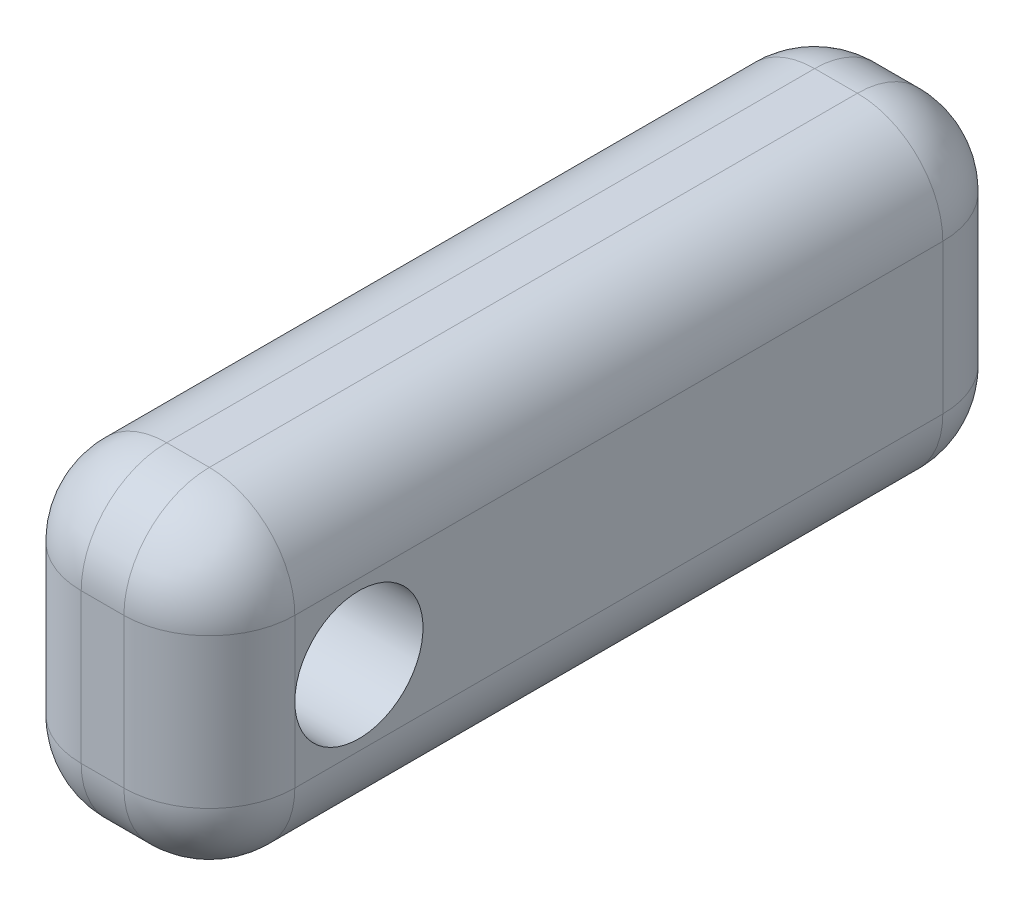
ISO-10303-21;
HEADER;
FILE_DESCRIPTION(('STEP AP214'),'2;1');
FILE_NAME('part.step','',(''),(''),'','','');
FILE_SCHEMA(('AUTOMOTIVE_DESIGN { 1 0 10303 214 1 1 1 1 }'));
ENDSEC;
DATA;
#1=APPLICATION_CONTEXT('core data for automotive mechanical design processes');
#2=APPLICATION_PROTOCOL_DEFINITION('international standard','automotive_design',2000,#1);
#3=PRODUCT_CONTEXT('',#1,'mechanical');
#4=PRODUCT('Part','Part','',(#3));
#5=PRODUCT_RELATED_PRODUCT_CATEGORY('part','',(#4));
#6=PRODUCT_DEFINITION_FORMATION('','',#4);
#7=PRODUCT_DEFINITION_CONTEXT('part definition',#1,'design');
#8=PRODUCT_DEFINITION('design','',#6,#7);
#9=PRODUCT_DEFINITION_SHAPE('','',#8);
#10=(LENGTH_UNIT() NAMED_UNIT(*) SI_UNIT(.MILLI.,.METRE.));
#11=(NAMED_UNIT(*) PLANE_ANGLE_UNIT() SI_UNIT($,.RADIAN.));
#12=(NAMED_UNIT(*) SI_UNIT($,.STERADIAN.) SOLID_ANGLE_UNIT());
#13=UNCERTAINTY_MEASURE_WITH_UNIT(LENGTH_MEASURE(1.E-05),#10,'distance_accuracy_value','');
#14=(GEOMETRIC_REPRESENTATION_CONTEXT(3) GLOBAL_UNCERTAINTY_ASSIGNED_CONTEXT((#13)) GLOBAL_UNIT_ASSIGNED_CONTEXT((#10,
#11,#12)) REPRESENTATION_CONTEXT('',''));
#15=CARTESIAN_POINT('',(0.,0.,0.));
#16=DIRECTION('',(0.,0.,1.));
#17=DIRECTION('',(1.,0.,0.));
#18=AXIS2_PLACEMENT_3D('',#15,#16,#17);
#19=CARTESIAN_POINT('',(6.35,4.7625,0.));
#20=DIRECTION('',(0.,0.,1.));
#21=DIRECTION('',(-1.,0.,0.));
#22=AXIS2_PLACEMENT_3D('',#19,#20,#21);
#23=PLANE('',#22);
#24=CARTESIAN_POINT('',(3.175,0.,0.));
#25=DIRECTION('',(0.,0.,1.));
#26=DIRECTION('',(1.,0.,0.));
#27=AXIS2_PLACEMENT_3D('',#24,#25,#26);
#28=CIRCLE('',#27,1.778);
#29=CARTESIAN_POINT('',(2.54,-1.660740497489,0.));
#30=VERTEX_POINT('',#29);
#31=CARTESIAN_POINT('',(3.81,-1.660740497489,0.));
#32=VERTEX_POINT('',#31);
#33=EDGE_CURVE('E187',#30,#32,#28,.T.);
#34=ORIENTED_EDGE('',*,*,#33,.T.);
#35=DIRECTION('',(0.,-1.,0.));
#36=VECTOR('',#35,1.);
#37=CARTESIAN_POINT('',(3.81,4.7625,0.));
#38=LINE('',#37,#36);
#39=CARTESIAN_POINT('',(3.81,-2.2225,0.));
#40=VERTEX_POINT('',#39);
#41=EDGE_CURVE('E251',#40,#32,#38,.F.);
#42=ORIENTED_EDGE('',*,*,#41,.F.);
#43=DIRECTION('',(1.,0.,0.));
#44=VECTOR('',#43,1.);
#45=CARTESIAN_POINT('',(6.35,-2.2225,0.));
#46=LINE('',#45,#44);
#47=CARTESIAN_POINT('',(2.54,-2.2225,0.));
#48=VERTEX_POINT('',#47);
#49=EDGE_CURVE('E254',#48,#40,#46,.T.);
#50=ORIENTED_EDGE('',*,*,#49,.F.);
#51=DIRECTION('',(0.,-1.,0.));
#52=VECTOR('',#51,1.);
#53=CARTESIAN_POINT('',(2.54,4.7625,0.));
#54=LINE('',#53,#52);
#55=EDGE_CURVE('E257',#30,#48,#54,.T.);
#56=ORIENTED_EDGE('',*,*,#55,.F.);
#57=EDGE_LOOP('',(#34,#42,#50,#56));
#58=FACE_BOUND('',#57,.T.);
#59=ADVANCED_FACE('F47',(#58),#23,.F.);
#60=DIRECTION('',(1.,0.,0.));
#61=VECTOR('',#60,1.);
#62=CARTESIAN_POINT('',(6.35,2.2225,0.));
#63=LINE('',#62,#61);
#64=CARTESIAN_POINT('',(3.81,2.2225,0.));
#65=VERTEX_POINT('',#64);
#66=CARTESIAN_POINT('',(2.54,2.2225,0.));
#67=VERTEX_POINT('',#66);
#68=EDGE_CURVE('E245',#65,#67,#63,.F.);
#69=ORIENTED_EDGE('',*,*,#68,.F.);
#70=DIRECTION('',(0.,-1.,0.));
#71=VECTOR('',#70,1.);
#72=CARTESIAN_POINT('',(3.81,4.7625,0.));
#73=LINE('',#72,#71);
#74=CARTESIAN_POINT('',(3.81,1.660740497489,0.));
#75=VERTEX_POINT('',#74);
#76=EDGE_CURVE('E242',#75,#65,#73,.F.);
#77=ORIENTED_EDGE('',*,*,#76,.F.);
#78=CARTESIAN_POINT('',(2.54,1.660740497489,0.));
#79=VERTEX_POINT('',#78);
#80=EDGE_CURVE('E192',#75,#79,#28,.T.);
#81=ORIENTED_EDGE('',*,*,#80,.T.);
#82=DIRECTION('',(0.,-1.,0.));
#83=VECTOR('',#82,1.);
#84=CARTESIAN_POINT('',(2.54,4.7625,0.));
#85=LINE('',#84,#83);
#86=EDGE_CURVE('E248',#67,#79,#85,.T.);
#87=ORIENTED_EDGE('',*,*,#86,.F.);
#88=EDGE_LOOP('',(#69,#77,#81,#87));
#89=FACE_BOUND('',#88,.T.);
#90=ADVANCED_FACE('F366',(#89),#23,.F.);
#91=CARTESIAN_POINT('',(6.35,4.7625,24.3397581415084));
#92=DIRECTION('',(-1.,0.,0.));
#93=DIRECTION('',(0.,0.,-1.));
#94=AXIS2_PLACEMENT_3D('',#91,#92,#93);
#95=PLANE('',#94);
#96=DIRECTION('',(0.,0.,1.));
#97=VECTOR('',#96,1.);
#98=CARTESIAN_POINT('',(6.35,-2.2225,24.3397581415084));
#99=LINE('',#98,#97);
#100=CARTESIAN_POINT('',(6.35,-2.2225,2.54));
#101=VERTEX_POINT('',#100);
#102=CARTESIAN_POINT('',(6.35,-2.2225,21.7997581415084));
#103=VERTEX_POINT('',#102);
#104=EDGE_CURVE('E208',#101,#103,#99,.T.);
#105=ORIENTED_EDGE('',*,*,#104,.F.);
#106=DIRECTION('',(0.,-1.,0.));
#107=VECTOR('',#106,1.);
#108=CARTESIAN_POINT('',(6.35,4.7625,2.54));
#109=LINE('',#108,#107);
#110=CARTESIAN_POINT('',(6.35,2.2225,2.54));
#111=VERTEX_POINT('',#110);
#112=EDGE_CURVE('E200',#111,#101,#109,.T.);
#113=ORIENTED_EDGE('',*,*,#112,.F.);
#114=DIRECTION('',(0.,0.,1.));
#115=VECTOR('',#114,1.);
#116=CARTESIAN_POINT('',(6.35,2.2225,24.3397581415084));
#117=LINE('',#116,#115);
#118=CARTESIAN_POINT('',(6.35,2.2225,21.7997581415084));
#119=VERTEX_POINT('',#118);
#120=EDGE_CURVE('E205',#119,#111,#117,.F.);
#121=ORIENTED_EDGE('',*,*,#120,.F.);
#122=DIRECTION('',(0.,-1.,0.));
#123=VECTOR('',#122,1.);
#124=CARTESIAN_POINT('',(6.35,4.7625,21.7997581415084));
#125=LINE('',#124,#123);
#126=CARTESIAN_POINT('',(6.35,0.,21.7997581415084));
#127=VERTEX_POINT('',#126);
#128=EDGE_CURVE('E172',#127,#119,#125,.F.);
#129=ORIENTED_EDGE('',*,*,#128,.F.);
#130=CARTESIAN_POINT('',(6.35,0.,19.8947581415084));
#131=DIRECTION('',(1.,0.,0.));
#132=DIRECTION('',(0.,0.,-1.));
#133=AXIS2_PLACEMENT_3D('',#130,#131,#132);
#134=CIRCLE('',#133,1.905);
#135=EDGE_CURVE('E184',#127,#127,#134,.T.);
#136=ORIENTED_EDGE('',*,*,#135,.F.);
#137=DIRECTION('',(0.,-1.,0.));
#138=VECTOR('',#137,1.);
#139=CARTESIAN_POINT('',(6.35,4.7625,21.7997581415084));
#140=LINE('',#139,#138);
#141=EDGE_CURVE('E168',#103,#127,#140,.F.);
#142=ORIENTED_EDGE('',*,*,#141,.F.);
#143=EDGE_LOOP('',(#105,#113,#121,#129,#136,#142));
#144=FACE_BOUND('',#143,.T.);
#145=ADVANCED_FACE('F372',(#144),#95,.F.);
#146=CARTESIAN_POINT('',(0.,4.7625,24.3397581415084));
#147=DIRECTION('',(0.,0.,-1.));
#148=DIRECTION('',(1.,0.,0.));
#149=AXIS2_PLACEMENT_3D('',#146,#147,#148);
#150=PLANE('',#149);
#151=DIRECTION('',(-1.,0.,0.));
#152=VECTOR('',#151,1.);
#153=CARTESIAN_POINT('',(0.,2.2225,24.3397581415084));
#154=LINE('',#153,#152);
#155=CARTESIAN_POINT('',(2.54,2.2225,24.3397581415084));
#156=VERTEX_POINT('',#155);
#157=CARTESIAN_POINT('',(3.81,2.2225,24.3397581415084));
#158=VERTEX_POINT('',#157);
#159=EDGE_CURVE('E282',#156,#158,#154,.F.);
#160=ORIENTED_EDGE('',*,*,#159,.F.);
#161=DIRECTION('',(0.,-1.,0.));
#162=VECTOR('',#161,1.);
#163=CARTESIAN_POINT('',(2.54,4.7625,24.3397581415084));
#164=LINE('',#163,#162);
#165=CARTESIAN_POINT('',(2.54,-2.2225,24.3397581415084));
#166=VERTEX_POINT('',#165);
#167=EDGE_CURVE('E278',#166,#156,#164,.F.);
#168=ORIENTED_EDGE('',*,*,#167,.F.);
#169=DIRECTION('',(-1.,0.,0.));
#170=VECTOR('',#169,1.);
#171=CARTESIAN_POINT('',(0.,-2.2225,24.3397581415084));
#172=LINE('',#171,#170);
#173=CARTESIAN_POINT('',(3.81,-2.2225,24.3397581415084));
#174=VERTEX_POINT('',#173);
#175=EDGE_CURVE('E274',#174,#166,#172,.T.);
#176=ORIENTED_EDGE('',*,*,#175,.F.);
#177=DIRECTION('',(0.,-1.,0.));
#178=VECTOR('',#177,1.);
#179=CARTESIAN_POINT('',(3.81,4.7625,24.3397581415084));
#180=LINE('',#179,#178);
#181=EDGE_CURVE('E285',#158,#174,#180,.T.);
#182=ORIENTED_EDGE('',*,*,#181,.F.);
#183=EDGE_LOOP('',(#160,#168,#176,#182));
#184=FACE_BOUND('',#183,.T.);
#185=ADVANCED_FACE('F483',(#184),#150,.F.);
#186=CARTESIAN_POINT('',(0.,4.7625,0.));
#187=DIRECTION('',(1.,0.,0.));
#188=DIRECTION('',(0.,0.,1.));
#189=AXIS2_PLACEMENT_3D('',#186,#187,#188);
#190=PLANE('',#189);
#191=DIRECTION('',(0.,0.,-1.));
#192=VECTOR('',#191,1.);
#193=CARTESIAN_POINT('',(0.,2.2225,0.));
#194=LINE('',#193,#192);
#195=CARTESIAN_POINT('',(0.,2.2225,2.54));
#196=VERTEX_POINT('',#195);
#197=CARTESIAN_POINT('',(0.,2.2225,21.7997581415084));
#198=VERTEX_POINT('',#197);
#199=EDGE_CURVE('E227',#196,#198,#194,.F.);
#200=ORIENTED_EDGE('',*,*,#199,.F.);
#201=DIRECTION('',(0.,-1.,0.));
#202=VECTOR('',#201,1.);
#203=CARTESIAN_POINT('',(0.,4.7625,2.54));
#204=LINE('',#203,#202);
#205=CARTESIAN_POINT('',(0.,-2.2225,2.54));
#206=VERTEX_POINT('',#205);
#207=EDGE_CURVE('E224',#206,#196,#204,.F.);
#208=ORIENTED_EDGE('',*,*,#207,.F.);
#209=DIRECTION('',(0.,0.,-1.));
#210=VECTOR('',#209,1.);
#211=CARTESIAN_POINT('',(0.,-2.2225,0.));
#212=LINE('',#211,#210);
#213=CARTESIAN_POINT('',(0.,-2.2225,21.7997581415084));
#214=VERTEX_POINT('',#213);
#215=EDGE_CURVE('E231',#214,#206,#212,.T.);
#216=ORIENTED_EDGE('',*,*,#215,.F.);
#217=DIRECTION('',(0.,-1.,0.));
#218=VECTOR('',#217,1.);
#219=CARTESIAN_POINT('',(0.,4.7625,21.7997581415084));
#220=LINE('',#219,#218);
#221=CARTESIAN_POINT('',(0.,0.,21.7997581415084));
#222=VERTEX_POINT('',#221);
#223=EDGE_CURVE('E235',#222,#214,#220,.T.);
#224=ORIENTED_EDGE('',*,*,#223,.F.);
#225=CARTESIAN_POINT('',(0.,0.,19.8947581415084));
#226=DIRECTION('',(1.,0.,0.));
#227=DIRECTION('',(0.,0.,-1.));
#228=AXIS2_PLACEMENT_3D('',#225,#226,#227);
#229=CIRCLE('',#228,1.905);
#230=EDGE_CURVE('E188',#222,#222,#229,.T.);
#231=ORIENTED_EDGE('',*,*,#230,.T.);
#232=DIRECTION('',(0.,-1.,0.));
#233=VECTOR('',#232,1.);
#234=CARTESIAN_POINT('',(0.,4.7625,21.7997581415084));
#235=LINE('',#234,#233);
#236=EDGE_CURVE('E239',#198,#222,#235,.T.);
#237=ORIENTED_EDGE('',*,*,#236,.F.);
#238=EDGE_LOOP('',(#200,#208,#216,#224,#231,#237));
#239=FACE_BOUND('',#238,.T.);
#240=ADVANCED_FACE('F477',(#239),#190,.F.);
#241=CARTESIAN_POINT('',(0.,4.7625,0.));
#242=DIRECTION('',(0.,-1.,0.));
#243=DIRECTION('',(0.,0.,1.));
#244=AXIS2_PLACEMENT_3D('',#241,#242,#243);
#245=PLANE('',#244);
#246=DIRECTION('',(0.,0.,-1.));
#247=VECTOR('',#246,1.);
#248=CARTESIAN_POINT('',(2.54,4.7625,0.));
#249=LINE('',#248,#247);
#250=CARTESIAN_POINT('',(2.54,4.7625,21.7997581415084));
#251=VERTEX_POINT('',#250);
#252=CARTESIAN_POINT('',(2.54,4.7625,2.54));
#253=VERTEX_POINT('',#252);
#254=EDGE_CURVE('E267',#251,#253,#249,.T.);
#255=ORIENTED_EDGE('',*,*,#254,.F.);
#256=DIRECTION('',(-1.,0.,0.));
#257=VECTOR('',#256,1.);
#258=CARTESIAN_POINT('',(0.,4.7625,21.7997581415084));
#259=LINE('',#258,#257);
#260=CARTESIAN_POINT('',(3.81,4.7625,21.7997581415084));
#261=VERTEX_POINT('',#260);
#262=EDGE_CURVE('E260',#261,#251,#259,.T.);
#263=ORIENTED_EDGE('',*,*,#262,.F.);
#264=DIRECTION('',(0.,0.,1.));
#265=VECTOR('',#264,1.);
#266=CARTESIAN_POINT('',(3.81,4.7625,0.));
#267=LINE('',#266,#265);
#268=CARTESIAN_POINT('',(3.81,4.7625,2.54));
#269=VERTEX_POINT('',#268);
#270=EDGE_CURVE('E263',#269,#261,#267,.T.);
#271=ORIENTED_EDGE('',*,*,#270,.F.);
#272=DIRECTION('',(1.,0.,0.));
#273=VECTOR('',#272,1.);
#274=CARTESIAN_POINT('',(0.,4.7625,2.54));
#275=LINE('',#274,#273);
#276=EDGE_CURVE('E271',#253,#269,#275,.T.);
#277=ORIENTED_EDGE('',*,*,#276,.F.);
#278=EDGE_LOOP('',(#255,#263,#271,#277));
#279=FACE_BOUND('',#278,.T.);
#280=ADVANCED_FACE('F490',(#279),#245,.F.);
#281=CARTESIAN_POINT('',(0.,-4.7625,0.));
#282=DIRECTION('',(0.,-1.,0.));
#283=DIRECTION('',(0.,0.,1.));
#284=AXIS2_PLACEMENT_3D('',#281,#282,#283);
#285=PLANE('',#284);
#286=DIRECTION('',(0.,0.,1.));
#287=VECTOR('',#286,1.);
#288=CARTESIAN_POINT('',(3.81,-4.7625,0.));
#289=LINE('',#288,#287);
#290=CARTESIAN_POINT('',(3.81,-4.7625,21.7997581415084));
#291=VERTEX_POINT('',#290);
#292=CARTESIAN_POINT('',(3.81,-4.7625,2.54));
#293=VERTEX_POINT('',#292);
#294=EDGE_CURVE('E218',#291,#293,#289,.F.);
#295=ORIENTED_EDGE('',*,*,#294,.F.);
#296=DIRECTION('',(-1.,0.,0.));
#297=VECTOR('',#296,1.);
#298=CARTESIAN_POINT('',(6.35,-4.7625,21.7997581415084));
#299=LINE('',#298,#297);
#300=CARTESIAN_POINT('',(2.54,-4.7625,21.7997581415084));
#301=VERTEX_POINT('',#300);
#302=EDGE_CURVE('E181',#301,#291,#299,.F.);
#303=ORIENTED_EDGE('',*,*,#302,.F.);
#304=DIRECTION('',(0.,0.,-1.));
#305=VECTOR('',#304,1.);
#306=CARTESIAN_POINT('',(2.54,-4.7625,24.3397581415084));
#307=LINE('',#306,#305);
#308=CARTESIAN_POINT('',(2.54,-4.7625,2.54));
#309=VERTEX_POINT('',#308);
#310=EDGE_CURVE('E215',#309,#301,#307,.F.);
#311=ORIENTED_EDGE('',*,*,#310,.F.);
#312=DIRECTION('',(1.,0.,0.));
#313=VECTOR('',#312,1.);
#314=CARTESIAN_POINT('',(0.,-4.7625,2.54));
#315=LINE('',#314,#313);
#316=EDGE_CURVE('E221',#293,#309,#315,.F.);
#317=ORIENTED_EDGE('',*,*,#316,.F.);
#318=EDGE_LOOP('',(#295,#303,#311,#317));
#319=FACE_BOUND('',#318,.T.);
#320=ADVANCED_FACE('F415',(#319),#285,.T.);
#321=CARTESIAN_POINT('',(3.175,0.,9.525));
#322=DIRECTION('',(0.,0.,-1.));
#323=DIRECTION('',(1.,0.,0.));
#324=AXIS2_PLACEMENT_3D('',#321,#322,#323);
#325=CYLINDRICAL_SURFACE('',#324,1.778);
#326=CARTESIAN_POINT('',(3.175,0.,9.525));
#327=DIRECTION('',(0.,0.,1.));
#328=DIRECTION('',(1.,0.,0.));
#329=AXIS2_PLACEMENT_3D('',#326,#327,#328);
#330=CIRCLE('',#329,1.778);
#331=CARTESIAN_POINT('',(4.953,0.,9.525));
#332=VERTEX_POINT('',#331);
#333=EDGE_CURVE('E198',#332,#332,#330,.T.);
#334=ORIENTED_EDGE('',*,*,#333,.T.);
#335=EDGE_LOOP('',(#334));
#336=FACE_BOUND('',#335,.T.);
#337=ORIENTED_EDGE('',*,*,#80,.F.);
#338=CARTESIAN_POINT('',(3.81,-1.660740497489,0.));
#339=CARTESIAN_POINT('',(3.85452772926789,-1.6437187364104,-4.68155323378838E-06));
#340=CARTESIAN_POINT('',(3.89833473831323,-1.62491135271473,0.00117147703703333));
#341=CARTESIAN_POINT('',(3.9841805562793,-1.58390975104958,0.00561595792695614));
#342=CARTESIAN_POINT('',(4.02622082868699,-1.5617184096697,0.0088825107208981));
#343=CARTESIAN_POINT('',(4.14881719803869,-1.49058475891008,0.0213669359738534));
#344=CARTESIAN_POINT('',(4.22639395181376,-1.43687275632313,0.033276135830476));
#345=CARTESIAN_POINT('',(4.3713338813828,-1.31864090358608,0.0617014759921788));
#346=CARTESIAN_POINT('',(4.43872511118705,-1.25415180943826,0.078204592814445));
#347=CARTESIAN_POINT('',(4.56252924128273,-1.11565543579056,0.113182472353516));
#348=CARTESIAN_POINT('',(4.6189226201244,-1.04163161163532,0.131660652483963));
#349=CARTESIAN_POINT('',(4.72360156832052,-0.879303036611328,0.16928822319485));
#350=CARTESIAN_POINT('',(4.77087892631078,-0.790329753933799,0.188373227754642));
#351=CARTESIAN_POINT('',(4.84992850370309,-0.605003459714666,0.222240343505682));
#352=CARTESIAN_POINT('',(4.88171235848853,-0.508656049141545,0.237025680304498));
#353=CARTESIAN_POINT('',(4.92800469058137,-0.313231501164486,0.25913979592096));
#354=CARTESIAN_POINT('',(4.94287000558628,-0.214257636644788,0.266622103018877));
#355=CARTESIAN_POINT('',(4.95573408599836,-0.0149693635533953,0.273073570055918));
#356=CARTESIAN_POINT('',(4.95374327855501,0.0853441779541245,0.27204799295599));
#357=CARTESIAN_POINT('',(4.93404265094767,0.27423098527128,0.26223398938119));
#358=CARTESIAN_POINT('',(4.9178543382215,0.363009553980252,0.254197348736134));
#359=CARTESIAN_POINT('',(4.8724961488604,0.536503942080445,0.232766751731216));
#360=CARTESIAN_POINT('',(4.84332159940513,0.621218286881341,0.219370867137493));
#361=CARTESIAN_POINT('',(4.77138788169125,0.788328847267599,0.188634249129413));
#362=CARTESIAN_POINT('',(4.72809890562674,0.870469081955778,0.171148753814196));
#363=CARTESIAN_POINT('',(4.62937860299746,1.02695418285871,0.135218258689977));
#364=CARTESIAN_POINT('',(4.57393556606563,1.10129142807956,0.11677234668491));
#365=CARTESIAN_POINT('',(4.44608426252645,1.24736965148504,0.0799519575862334));
#366=CARTESIAN_POINT('',(4.37256149283965,1.31818476984897,0.0617525214542067));
#367=CARTESIAN_POINT('',(4.2138269233365,1.44654000964742,0.0310144133001352));
#368=CARTESIAN_POINT('',(4.1286458306184,1.50411397338244,0.0184612299725655));
#369=CARTESIAN_POINT('',(4.00215608146291,1.57444475177786,0.00700800270153899));
#370=CARTESIAN_POINT('',(3.96462685519834,1.59359703142778,0.00442262873260868));
#371=CARTESIAN_POINT('',(3.88825291885346,1.62921050026388,0.000918070527373948));
#372=CARTESIAN_POINT('',(3.8494086209482,1.64567252338552,-1.63093482095433E-06));
#373=CARTESIAN_POINT('',(3.81,1.660740497489,0.));
#374=B_SPLINE_CURVE_WITH_KNOTS('',3,(#338,#339,#340,#341,#342,#343,#344,#345,#346,#347,#348,
#349,#350,#351,#352,#353,#354,#355,#356,#357,#358,#359,#360,#361,#362,#363,#364,#365,#366,#367,
#368,#369,#370,#371,#372,#373),.UNSPECIFIED.,.F.,.F.,(4,2,2,2,2,2,2,2,2,2,2,2,2,2,2,2,2,4),(0.,
0.142894710670892,0.28566862157115,0.56948911396482,0.852513045787876,1.13603486854599,
1.44221640250242,1.74816764321626,2.04753883272512,2.34672484560268,2.61729798810029,
2.88796856937623,3.17026852735781,3.45284168461751,3.76239960349769,4.07115732388665,
4.1976791691344,4.32416171998233),.UNSPECIFIED.);
#375=EDGE_CURVE('E56',#32,#75,#374,.T.);
#376=ORIENTED_EDGE('',*,*,#375,.F.);
#377=ORIENTED_EDGE('',*,*,#33,.F.);
#378=CARTESIAN_POINT('',(2.54,1.660740497489,0.));
#379=CARTESIAN_POINT('',(2.49547227073211,1.6437187364104,-4.6815532339741E-06));
#380=CARTESIAN_POINT('',(2.45166526168677,1.62491135271473,0.00117147703703294));
#381=CARTESIAN_POINT('',(2.3658194437207,1.58390975104958,0.00561595792695538));
#382=CARTESIAN_POINT('',(2.32377917131301,1.5617184096697,0.00888251072089721));
#383=CARTESIAN_POINT('',(2.2011828019613,1.49058475891008,0.0213669359738522));
#384=CARTESIAN_POINT('',(2.12360604818624,1.43687275632313,0.0332761358304749));
#385=CARTESIAN_POINT('',(1.9786661186172,1.31864090358608,0.0617014759921781));
#386=CARTESIAN_POINT('',(1.91127488881294,1.25415180943826,0.0782045928144446));
#387=CARTESIAN_POINT('',(1.78747075871726,1.11565543579056,0.113182472353515));
#388=CARTESIAN_POINT('',(1.7310773798756,1.04163161163532,0.131660652483962));
#389=CARTESIAN_POINT('',(1.62639843167948,0.879303036611327,0.169288223194848));
#390=CARTESIAN_POINT('',(1.57912107368922,0.790329753933799,0.188373227754641));
#391=CARTESIAN_POINT('',(1.50007149629691,0.605003459714666,0.222240343505681));
#392=CARTESIAN_POINT('',(1.46828764151147,0.508656049141545,0.237025680304497));
#393=CARTESIAN_POINT('',(1.42199530941863,0.313231501164487,0.259139795920959));
#394=CARTESIAN_POINT('',(1.40712999441372,0.214257636644788,0.266622103018876));
#395=CARTESIAN_POINT('',(1.39426591400164,0.0149693635533956,0.273073570055917));
#396=CARTESIAN_POINT('',(1.39625672144499,-0.0853441779541243,0.27204799295599));
#397=CARTESIAN_POINT('',(1.41595734905233,-0.274230985271281,0.26223398938119));
#398=CARTESIAN_POINT('',(1.4321456617785,-0.363009553980252,0.254197348736134));
#399=CARTESIAN_POINT('',(1.47750385113959,-0.536503942080445,0.232766751731216));
#400=CARTESIAN_POINT('',(1.50667840059487,-0.621218286881341,0.219370867137492));
#401=CARTESIAN_POINT('',(1.57861211830875,-0.788328847267598,0.188634249129412));
#402=CARTESIAN_POINT('',(1.62190109437326,-0.870469081955778,0.171148753814195));
#403=CARTESIAN_POINT('',(1.72062139700254,-1.02695418285871,0.135218258689976));
#404=CARTESIAN_POINT('',(1.77606443393437,-1.10129142807956,0.11677234668491));
#405=CARTESIAN_POINT('',(1.90391573747355,-1.24736965148504,0.0799519575862327));
#406=CARTESIAN_POINT('',(1.97743850716035,-1.31818476984897,0.0617525214542059));
#407=CARTESIAN_POINT('',(2.1361730766635,-1.44654000964742,0.0310144133001349));
#408=CARTESIAN_POINT('',(2.2213541693816,-1.50411397338244,0.0184612299725658));
#409=CARTESIAN_POINT('',(2.34784391853709,-1.57444475177786,0.00700800270153869));
#410=CARTESIAN_POINT('',(2.38537314480166,-1.59359703142778,0.004422628732608));
#411=CARTESIAN_POINT('',(2.46174708114654,-1.62921050026388,0.000918070527372723));
#412=CARTESIAN_POINT('',(2.5005913790518,-1.64567252338552,-1.6309348223602E-06));
#413=CARTESIAN_POINT('',(2.54,-1.660740497489,0.));
#414=B_SPLINE_CURVE_WITH_KNOTS('',3,(#378,#379,#380,#381,#382,#383,#384,#385,#386,#387,#388,
#389,#390,#391,#392,#393,#394,#395,#396,#397,#398,#399,#400,#401,#402,#403,#404,#405,#406,#407,
#408,#409,#410,#411,#412,#413),.UNSPECIFIED.,.F.,.F.,(4,2,2,2,2,2,2,2,2,2,2,2,2,2,2,2,2,4),(0.,
0.142894710670891,0.28566862157115,0.56948911396482,0.852513045787876,1.13603486854599,
1.44221640250242,1.74816764321626,2.04753883272512,2.34672484560268,2.61729798810029,
2.88796856937623,3.17026852735781,3.45284168461751,3.76239960349769,4.07115732388665,
4.1976791691344,4.32416171998233),.UNSPECIFIED.);
#415=EDGE_CURVE('E11',#79,#30,#414,.T.);
#416=ORIENTED_EDGE('',*,*,#415,.F.);
#417=EDGE_LOOP('',(#337,#376,#377,#416));
#418=FACE_BOUND('',#417,.T.);
#419=ADVANCED_FACE('F300',(#336,#418),#325,.F.);
#420=CARTESIAN_POINT('',(3.175,0.,9.525));
#421=DIRECTION('',(0.,0.,-1.));
#422=DIRECTION('',(1.,0.,0.));
#423=AXIS2_PLACEMENT_3D('',#420,#421,#422);
#424=PLANE('',#423);
#425=ORIENTED_EDGE('',*,*,#333,.F.);
#426=EDGE_LOOP('',(#425));
#427=FACE_BOUND('',#426,.T.);
#428=ADVANCED_FACE('F529',(#427),#424,.T.);
#429=CARTESIAN_POINT('',(9.525,0.,19.8947581415084));
#430=DIRECTION('',(-1.,0.,0.));
#431=DIRECTION('',(0.,0.,-1.));
#432=AXIS2_PLACEMENT_3D('',#429,#430,#431);
#433=CYLINDRICAL_SURFACE('',#432,1.905);
#434=ORIENTED_EDGE('',*,*,#230,.F.);
#435=EDGE_LOOP('',(#434));
#436=FACE_BOUND('',#435,.T.);
#437=ORIENTED_EDGE('',*,*,#135,.T.);
#438=EDGE_LOOP('',(#437));
#439=FACE_BOUND('',#438,.T.);
#440=ADVANCED_FACE('F185',(#436,#439),#433,.F.);
#441=CARTESIAN_POINT('',(2.54,2.2225,0.));
#442=DIRECTION('',(0.,0.,-1.));
#443=DIRECTION('',(1.,0.,0.));
#444=AXIS2_PLACEMENT_3D('',#441,#442,#443);
#445=CYLINDRICAL_SURFACE('',#444,2.54);
#446=CARTESIAN_POINT('',(2.54,2.2225,2.54));
#447=DIRECTION('',(0.,0.,1.));
#448=DIRECTION('',(1.,0.,0.));
#449=AXIS2_PLACEMENT_3D('',#446,#447,#448);
#450=CIRCLE('',#449,2.54);
#451=EDGE_CURVE('E51',#253,#196,#450,.T.);
#452=ORIENTED_EDGE('',*,*,#451,.T.);
#453=ORIENTED_EDGE('',*,*,#199,.T.);
#454=CARTESIAN_POINT('',(2.54,2.2225,21.7997581415084));
#455=DIRECTION('',(0.,0.,-1.));
#456=DIRECTION('',(-1.,0.,0.));
#457=AXIS2_PLACEMENT_3D('',#454,#455,#456);
#458=CIRCLE('',#457,2.54);
#459=EDGE_CURVE('E463',#198,#251,#458,.T.);
#460=ORIENTED_EDGE('',*,*,#459,.T.);
#461=ORIENTED_EDGE('',*,*,#254,.T.);
#462=EDGE_LOOP('',(#452,#453,#460,#461));
#463=FACE_BOUND('',#462,.T.);
#464=ADVANCED_FACE('F49',(#463),#445,.T.);
#465=CARTESIAN_POINT('',(2.54,2.2225,2.54));
#466=DIRECTION('',(-1.,0.,0.));
#467=DIRECTION('',(0.,0.,-1.));
#468=AXIS2_PLACEMENT_3D('',#465,#466,#467);
#469=SPHERICAL_SURFACE('',#468,2.54);
#470=CARTESIAN_POINT('',(2.54,2.2225,2.54));
#471=DIRECTION('',(1.,0.,0.));
#472=DIRECTION('',(0.,0.,-1.));
#473=AXIS2_PLACEMENT_3D('',#470,#471,#472);
#474=CIRCLE('',#473,2.54);
#475=EDGE_CURVE('E460',#253,#67,#474,.F.);
#476=ORIENTED_EDGE('',*,*,#475,.T.);
#477=CARTESIAN_POINT('',(2.54,2.2225,2.54));
#478=DIRECTION('',(0.,-1.,0.));
#479=DIRECTION('',(0.,0.,-1.));
#480=AXIS2_PLACEMENT_3D('',#477,#478,#479);
#481=CIRCLE('',#480,2.54);
#482=EDGE_CURVE('E462',#67,#196,#481,.F.);
#483=ORIENTED_EDGE('',*,*,#482,.T.);
#484=ORIENTED_EDGE('',*,*,#451,.F.);
#485=EDGE_LOOP('',(#476,#483,#484));
#486=FACE_BOUND('',#485,.T.);
#487=ADVANCED_FACE('F356',(#486),#469,.T.);
#488=CARTESIAN_POINT('',(2.54,2.2225,21.7997581415084));
#489=DIRECTION('',(0.,1.,0.));
#490=DIRECTION('',(0.,0.,-1.));
#491=AXIS2_PLACEMENT_3D('',#488,#489,#490);
#492=SPHERICAL_SURFACE('',#491,2.54);
#493=CARTESIAN_POINT('',(2.54,2.2225,21.7997581415084));
#494=DIRECTION('',(0.,-1.,0.));
#495=DIRECTION('',(0.,0.,-1.));
#496=AXIS2_PLACEMENT_3D('',#493,#494,#495);
#497=CIRCLE('',#496,2.54);
#498=EDGE_CURVE('E455',#198,#156,#497,.F.);
#499=ORIENTED_EDGE('',*,*,#498,.T.);
#500=CARTESIAN_POINT('',(2.54,2.2225,21.7997581415084));
#501=DIRECTION('',(1.,0.,0.));
#502=DIRECTION('',(0.,0.,-1.));
#503=AXIS2_PLACEMENT_3D('',#500,#501,#502);
#504=CIRCLE('',#503,2.54);
#505=EDGE_CURVE('E78',#156,#251,#504,.F.);
#506=ORIENTED_EDGE('',*,*,#505,.T.);
#507=ORIENTED_EDGE('',*,*,#459,.F.);
#508=EDGE_LOOP('',(#499,#506,#507));
#509=FACE_BOUND('',#508,.T.);
#510=ADVANCED_FACE('F353',(#509),#492,.T.);
#511=CARTESIAN_POINT('',(2.54,4.7625,2.54));
#512=DIRECTION('',(0.,-1.,0.));
#513=DIRECTION('',(0.,0.,1.));
#514=AXIS2_PLACEMENT_3D('',#511,#512,#513);
#515=CYLINDRICAL_SURFACE('',#514,2.54);
#516=ORIENTED_EDGE('',*,*,#482,.F.);
#517=ORIENTED_EDGE('',*,*,#86,.T.);
#518=ORIENTED_EDGE('',*,*,#415,.T.);
#519=ORIENTED_EDGE('',*,*,#55,.T.);
#520=CARTESIAN_POINT('',(2.54,-2.2225,2.54));
#521=DIRECTION('',(0.,1.,0.));
#522=DIRECTION('',(0.,0.,1.));
#523=AXIS2_PLACEMENT_3D('',#520,#521,#522);
#524=CIRCLE('',#523,2.54);
#525=EDGE_CURVE('E451',#48,#206,#524,.T.);
#526=ORIENTED_EDGE('',*,*,#525,.T.);
#527=ORIENTED_EDGE('',*,*,#207,.T.);
#528=EDGE_LOOP('',(#516,#517,#518,#519,#526,#527));
#529=FACE_BOUND('',#528,.T.);
#530=ADVANCED_FACE('F348',(#529),#515,.T.);
#531=CARTESIAN_POINT('',(0.,2.2225,2.54));
#532=DIRECTION('',(1.,0.,0.));
#533=DIRECTION('',(0.,0.,1.));
#534=AXIS2_PLACEMENT_3D('',#531,#532,#533);
#535=CYLINDRICAL_SURFACE('',#534,2.54);
#536=ORIENTED_EDGE('',*,*,#475,.F.);
#537=ORIENTED_EDGE('',*,*,#276,.T.);
#538=CARTESIAN_POINT('',(3.81,2.2225,2.54));
#539=DIRECTION('',(-1.,0.,0.));
#540=DIRECTION('',(0.,0.,1.));
#541=AXIS2_PLACEMENT_3D('',#538,#539,#540);
#542=CIRCLE('',#541,2.54);
#543=EDGE_CURVE('E448',#269,#65,#542,.T.);
#544=ORIENTED_EDGE('',*,*,#543,.T.);
#545=ORIENTED_EDGE('',*,*,#68,.T.);
#546=EDGE_LOOP('',(#536,#537,#544,#545));
#547=FACE_BOUND('',#546,.T.);
#548=ADVANCED_FACE('F345',(#547),#535,.T.);
#549=CARTESIAN_POINT('',(3.81,2.2225,0.));
#550=DIRECTION('',(0.,0.,1.));
#551=DIRECTION('',(-1.,0.,0.));
#552=AXIS2_PLACEMENT_3D('',#549,#550,#551);
#553=CYLINDRICAL_SURFACE('',#552,2.54);
#554=CARTESIAN_POINT('',(3.81,2.2225,21.7997581415084));
#555=DIRECTION('',(0.,0.,-1.));
#556=DIRECTION('',(-1.,0.,0.));
#557=AXIS2_PLACEMENT_3D('',#554,#555,#556);
#558=CIRCLE('',#557,2.54);
#559=EDGE_CURVE('E442',#261,#119,#558,.T.);
#560=ORIENTED_EDGE('',*,*,#559,.T.);
#561=ORIENTED_EDGE('',*,*,#120,.T.);
#562=CARTESIAN_POINT('',(3.81,2.2225,2.54));
#563=DIRECTION('',(0.,0.,1.));
#564=DIRECTION('',(0.,-1.,0.));
#565=AXIS2_PLACEMENT_3D('',#562,#563,#564);
#566=CIRCLE('',#565,2.54);
#567=EDGE_CURVE('E446',#111,#269,#566,.T.);
#568=ORIENTED_EDGE('',*,*,#567,.T.);
#569=ORIENTED_EDGE('',*,*,#270,.T.);
#570=EDGE_LOOP('',(#560,#561,#568,#569));
#571=FACE_BOUND('',#570,.T.);
#572=ADVANCED_FACE('F342',(#571),#553,.T.);
#573=CARTESIAN_POINT('',(0.,2.2225,21.7997581415084));
#574=DIRECTION('',(-1.,0.,0.));
#575=DIRECTION('',(0.,0.,-1.));
#576=AXIS2_PLACEMENT_3D('',#573,#574,#575);
#577=CYLINDRICAL_SURFACE('',#576,2.54);
#578=ORIENTED_EDGE('',*,*,#505,.F.);
#579=ORIENTED_EDGE('',*,*,#159,.T.);
#580=CARTESIAN_POINT('',(3.81,2.2225,21.7997581415084));
#581=DIRECTION('',(-1.,0.,0.));
#582=DIRECTION('',(0.,0.,1.));
#583=AXIS2_PLACEMENT_3D('',#580,#581,#582);
#584=CIRCLE('',#583,2.54);
#585=EDGE_CURVE('E439',#158,#261,#584,.T.);
#586=ORIENTED_EDGE('',*,*,#585,.T.);
#587=ORIENTED_EDGE('',*,*,#262,.T.);
#588=EDGE_LOOP('',(#578,#579,#586,#587));
#589=FACE_BOUND('',#588,.T.);
#590=ADVANCED_FACE('F338',(#589),#577,.T.);
#591=CARTESIAN_POINT('',(2.54,4.7625,21.7997581415084));
#592=DIRECTION('',(0.,-1.,0.));
#593=DIRECTION('',(0.,0.,1.));
#594=AXIS2_PLACEMENT_3D('',#591,#592,#593);
#595=CYLINDRICAL_SURFACE('',#594,2.54);
#596=ORIENTED_EDGE('',*,*,#498,.F.);
#597=ORIENTED_EDGE('',*,*,#236,.T.);
#598=ORIENTED_EDGE('',*,*,#223,.T.);
#599=CARTESIAN_POINT('',(2.54,-2.2225,21.7997581415084));
#600=DIRECTION('',(0.,1.,0.));
#601=DIRECTION('',(0.,0.,1.));
#602=AXIS2_PLACEMENT_3D('',#599,#600,#601);
#603=CIRCLE('',#602,2.54);
#604=EDGE_CURVE('E406',#214,#166,#603,.T.);
#605=ORIENTED_EDGE('',*,*,#604,.T.);
#606=ORIENTED_EDGE('',*,*,#167,.T.);
#607=EDGE_LOOP('',(#596,#597,#598,#605,#606));
#608=FACE_BOUND('',#607,.T.);
#609=ADVANCED_FACE('F334',(#608),#595,.T.);
#610=CARTESIAN_POINT('',(2.54,-2.2225,0.));
#611=DIRECTION('',(0.,0.,1.));
#612=DIRECTION('',(-1.,0.,0.));
#613=AXIS2_PLACEMENT_3D('',#610,#611,#612);
#614=CYLINDRICAL_SURFACE('',#613,2.54);
#615=CARTESIAN_POINT('',(2.54,-2.2225,2.54));
#616=DIRECTION('',(0.,0.,1.));
#617=DIRECTION('',(1.,0.,0.));
#618=AXIS2_PLACEMENT_3D('',#615,#616,#617);
#619=CIRCLE('',#618,2.54);
#620=EDGE_CURVE('E412',#206,#309,#619,.T.);
#621=ORIENTED_EDGE('',*,*,#620,.T.);
#622=ORIENTED_EDGE('',*,*,#310,.T.);
#623=CARTESIAN_POINT('',(2.54,-2.2225,21.7997581415084));
#624=DIRECTION('',(0.,0.,-1.));
#625=DIRECTION('',(-1.,0.,0.));
#626=AXIS2_PLACEMENT_3D('',#623,#624,#625);
#627=CIRCLE('',#626,2.54);
#628=EDGE_CURVE('E405',#301,#214,#627,.T.);
#629=ORIENTED_EDGE('',*,*,#628,.T.);
#630=ORIENTED_EDGE('',*,*,#215,.T.);
#631=EDGE_LOOP('',(#621,#622,#629,#630));
#632=FACE_BOUND('',#631,.T.);
#633=ADVANCED_FACE('F330',(#632),#614,.T.);
#634=CARTESIAN_POINT('',(2.54,-2.2225,2.54));
#635=DIRECTION('',(-1.,0.,0.));
#636=DIRECTION('',(0.,-1.,0.));
#637=AXIS2_PLACEMENT_3D('',#634,#635,#636);
#638=SPHERICAL_SURFACE('',#637,2.54);
#639=ORIENTED_EDGE('',*,*,#525,.F.);
#640=CARTESIAN_POINT('',(2.54,-2.2225,2.54));
#641=DIRECTION('',(1.,0.,0.));
#642=DIRECTION('',(0.,0.,-1.));
#643=AXIS2_PLACEMENT_3D('',#640,#641,#642);
#644=CIRCLE('',#643,2.54);
#645=EDGE_CURVE('E408',#48,#309,#644,.F.);
#646=ORIENTED_EDGE('',*,*,#645,.T.);
#647=ORIENTED_EDGE('',*,*,#620,.F.);
#648=EDGE_LOOP('',(#639,#646,#647));
#649=FACE_BOUND('',#648,.T.);
#650=ADVANCED_FACE('F326',(#649),#638,.T.);
#651=CARTESIAN_POINT('',(3.81,2.2225,2.54));
#652=DIRECTION('',(0.,1.,0.));
#653=DIRECTION('',(0.,0.,-1.));
#654=AXIS2_PLACEMENT_3D('',#651,#652,#653);
#655=SPHERICAL_SURFACE('',#654,2.54);
#656=ORIENTED_EDGE('',*,*,#567,.F.);
#657=CARTESIAN_POINT('',(3.81,2.2225,2.54));
#658=DIRECTION('',(0.,-1.,0.));
#659=DIRECTION('',(0.,0.,-1.));
#660=AXIS2_PLACEMENT_3D('',#657,#658,#659);
#661=CIRCLE('',#660,2.54);
#662=EDGE_CURVE('E434',#111,#65,#661,.F.);
#663=ORIENTED_EDGE('',*,*,#662,.T.);
#664=ORIENTED_EDGE('',*,*,#543,.F.);
#665=EDGE_LOOP('',(#656,#663,#664));
#666=FACE_BOUND('',#665,.T.);
#667=ADVANCED_FACE('F322',(#666),#655,.T.);
#668=CARTESIAN_POINT('',(3.81,2.2225,21.7997581415084));
#669=DIRECTION('',(0.,1.,0.));
#670=DIRECTION('',(0.,0.,-1.));
#671=AXIS2_PLACEMENT_3D('',#668,#669,#670);
#672=SPHERICAL_SURFACE('',#671,2.54);
#673=ORIENTED_EDGE('',*,*,#585,.F.);
#674=CARTESIAN_POINT('',(3.81,2.2225,21.7997581415084));
#675=DIRECTION('',(0.,-1.,0.));
#676=DIRECTION('',(0.,0.,-1.));
#677=AXIS2_PLACEMENT_3D('',#674,#675,#676);
#678=CIRCLE('',#677,2.54);
#679=EDGE_CURVE('E67',#158,#119,#678,.F.);
#680=ORIENTED_EDGE('',*,*,#679,.T.);
#681=ORIENTED_EDGE('',*,*,#559,.F.);
#682=EDGE_LOOP('',(#673,#680,#681));
#683=FACE_BOUND('',#682,.T.);
#684=ADVANCED_FACE('F318',(#683),#672,.T.);
#685=CARTESIAN_POINT('',(2.54,-2.2225,21.7997581415084));
#686=DIRECTION('',(-1.,0.,0.));
#687=DIRECTION('',(0.,-1.,0.));
#688=AXIS2_PLACEMENT_3D('',#685,#686,#687);
#689=SPHERICAL_SURFACE('',#688,2.54);
#690=ORIENTED_EDGE('',*,*,#628,.F.);
#691=CARTESIAN_POINT('',(2.54,-2.2225,21.7997581415084));
#692=DIRECTION('',(1.,0.,0.));
#693=DIRECTION('',(0.,0.,-1.));
#694=AXIS2_PLACEMENT_3D('',#691,#692,#693);
#695=CIRCLE('',#694,2.54);
#696=EDGE_CURVE('E394',#301,#166,#695,.F.);
#697=ORIENTED_EDGE('',*,*,#696,.T.);
#698=ORIENTED_EDGE('',*,*,#604,.F.);
#699=EDGE_LOOP('',(#690,#697,#698));
#700=FACE_BOUND('',#699,.T.);
#701=ADVANCED_FACE('F314',(#700),#689,.T.);
#702=CARTESIAN_POINT('',(6.35,-2.2225,2.54));
#703=DIRECTION('',(-1.,0.,0.));
#704=DIRECTION('',(0.,0.,-1.));
#705=AXIS2_PLACEMENT_3D('',#702,#703,#704);
#706=CYLINDRICAL_SURFACE('',#705,2.54);
#707=ORIENTED_EDGE('',*,*,#645,.F.);
#708=ORIENTED_EDGE('',*,*,#49,.T.);
#709=CARTESIAN_POINT('',(3.81,-2.2225,2.54));
#710=DIRECTION('',(-1.,0.,0.));
#711=DIRECTION('',(0.,0.,1.));
#712=AXIS2_PLACEMENT_3D('',#709,#710,#711);
#713=CIRCLE('',#712,2.54);
#714=EDGE_CURVE('E403',#40,#293,#713,.T.);
#715=ORIENTED_EDGE('',*,*,#714,.T.);
#716=ORIENTED_EDGE('',*,*,#316,.T.);
#717=EDGE_LOOP('',(#707,#708,#715,#716));
#718=FACE_BOUND('',#717,.T.);
#719=ADVANCED_FACE('F309',(#718),#706,.T.);
#720=CARTESIAN_POINT('',(3.81,4.7625,2.54));
#721=DIRECTION('',(0.,-1.,0.));
#722=DIRECTION('',(0.,0.,1.));
#723=AXIS2_PLACEMENT_3D('',#720,#721,#722);
#724=CYLINDRICAL_SURFACE('',#723,2.54);
#725=ORIENTED_EDGE('',*,*,#375,.T.);
#726=ORIENTED_EDGE('',*,*,#76,.T.);
#727=ORIENTED_EDGE('',*,*,#662,.F.);
#728=ORIENTED_EDGE('',*,*,#112,.T.);
#729=CARTESIAN_POINT('',(3.81,-2.2225,2.54));
#730=DIRECTION('',(0.,1.,0.));
#731=DIRECTION('',(0.,0.,1.));
#732=AXIS2_PLACEMENT_3D('',#729,#730,#731);
#733=CIRCLE('',#732,2.54);
#734=EDGE_CURVE('E425',#101,#40,#733,.T.);
#735=ORIENTED_EDGE('',*,*,#734,.T.);
#736=ORIENTED_EDGE('',*,*,#41,.T.);
#737=EDGE_LOOP('',(#725,#726,#727,#728,#735,#736));
#738=FACE_BOUND('',#737,.T.);
#739=ADVANCED_FACE('F304',(#738),#724,.T.);
#740=CARTESIAN_POINT('',(3.81,4.7625,21.7997581415084));
#741=DIRECTION('',(0.,-1.,0.));
#742=DIRECTION('',(0.,0.,1.));
#743=AXIS2_PLACEMENT_3D('',#740,#741,#742);
#744=CYLINDRICAL_SURFACE('',#743,2.54);
#745=ORIENTED_EDGE('',*,*,#128,.T.);
#746=ORIENTED_EDGE('',*,*,#679,.F.);
#747=ORIENTED_EDGE('',*,*,#181,.T.);
#748=CARTESIAN_POINT('',(3.81,-2.2225,21.7997581415084));
#749=DIRECTION('',(0.,1.,0.));
#750=DIRECTION('',(0.,0.,1.));
#751=AXIS2_PLACEMENT_3D('',#748,#749,#750);
#752=CIRCLE('',#751,2.54);
#753=EDGE_CURVE('E175',#174,#103,#752,.T.);
#754=ORIENTED_EDGE('',*,*,#753,.T.);
#755=ORIENTED_EDGE('',*,*,#141,.T.);
#756=EDGE_LOOP('',(#745,#746,#747,#754,#755));
#757=FACE_BOUND('',#756,.T.);
#758=ADVANCED_FACE('F170',(#757),#744,.T.);
#759=CARTESIAN_POINT('',(0.,-2.2225,21.7997581415084));
#760=DIRECTION('',(1.,0.,0.));
#761=DIRECTION('',(0.,0.,1.));
#762=AXIS2_PLACEMENT_3D('',#759,#760,#761);
#763=CYLINDRICAL_SURFACE('',#762,2.54);
#764=ORIENTED_EDGE('',*,*,#696,.F.);
#765=ORIENTED_EDGE('',*,*,#302,.T.);
#766=CARTESIAN_POINT('',(3.81,-2.2225,21.7997581415084));
#767=DIRECTION('',(-1.,0.,0.));
#768=DIRECTION('',(0.,0.,1.));
#769=AXIS2_PLACEMENT_3D('',#766,#767,#768);
#770=CIRCLE('',#769,2.54);
#771=EDGE_CURVE('E421',#291,#174,#770,.T.);
#772=ORIENTED_EDGE('',*,*,#771,.T.);
#773=ORIENTED_EDGE('',*,*,#175,.T.);
#774=EDGE_LOOP('',(#764,#765,#772,#773));
#775=FACE_BOUND('',#774,.T.);
#776=ADVANCED_FACE('F387',(#775),#763,.T.);
#777=CARTESIAN_POINT('',(3.81,-2.2225,2.54));
#778=DIRECTION('',(0.,0.,-1.));
#779=DIRECTION('',(0.,-1.,0.));
#780=AXIS2_PLACEMENT_3D('',#777,#778,#779);
#781=SPHERICAL_SURFACE('',#780,2.54);
#782=ORIENTED_EDGE('',*,*,#734,.F.);
#783=CARTESIAN_POINT('',(3.81,-2.2225,2.54));
#784=DIRECTION('',(0.,0.,1.));
#785=DIRECTION('',(1.,0.,0.));
#786=AXIS2_PLACEMENT_3D('',#783,#784,#785);
#787=CIRCLE('',#786,2.54);
#788=EDGE_CURVE('E416',#101,#293,#787,.F.);
#789=ORIENTED_EDGE('',*,*,#788,.T.);
#790=ORIENTED_EDGE('',*,*,#714,.F.);
#791=EDGE_LOOP('',(#782,#789,#790));
#792=FACE_BOUND('',#791,.T.);
#793=ADVANCED_FACE('F384',(#792),#781,.T.);
#794=CARTESIAN_POINT('',(3.81,-2.2225,21.7997581415084));
#795=DIRECTION('',(0.,0.,1.));
#796=DIRECTION('',(0.,1.,0.));
#797=AXIS2_PLACEMENT_3D('',#794,#795,#796);
#798=SPHERICAL_SURFACE('',#797,2.54);
#799=ORIENTED_EDGE('',*,*,#771,.F.);
#800=CARTESIAN_POINT('',(3.81,-2.2225,21.7997581415084));
#801=DIRECTION('',(0.,0.,-1.));
#802=DIRECTION('',(-1.,0.,0.));
#803=AXIS2_PLACEMENT_3D('',#800,#801,#802);
#804=CIRCLE('',#803,2.54);
#805=EDGE_CURVE('E418',#291,#103,#804,.F.);
#806=ORIENTED_EDGE('',*,*,#805,.T.);
#807=ORIENTED_EDGE('',*,*,#753,.F.);
#808=EDGE_LOOP('',(#799,#806,#807));
#809=FACE_BOUND('',#808,.T.);
#810=ADVANCED_FACE('F380',(#809),#798,.T.);
#811=CARTESIAN_POINT('',(3.81,-2.2225,24.3397581415084));
#812=DIRECTION('',(0.,0.,-1.));
#813=DIRECTION('',(1.,0.,0.));
#814=AXIS2_PLACEMENT_3D('',#811,#812,#813);
#815=CYLINDRICAL_SURFACE('',#814,2.54);
#816=ORIENTED_EDGE('',*,*,#788,.F.);
#817=ORIENTED_EDGE('',*,*,#104,.T.);
#818=ORIENTED_EDGE('',*,*,#805,.F.);
#819=ORIENTED_EDGE('',*,*,#294,.T.);
#820=EDGE_LOOP('',(#816,#817,#818,#819));
#821=FACE_BOUND('',#820,.T.);
#822=ADVANCED_FACE('F377',(#821),#815,.T.);
#823=CLOSED_SHELL('',(#59,#90,#145,#185,#240,#280,#320,#419,#428,#440,#464,#487,#510,#530,#548,
#572,#590,#609,#633,#650,#667,#684,#701,#719,#739,#758,#776,#793,#810,#822));
#824=MANIFOLD_SOLID_BREP('B2',#823);
#825=ADVANCED_BREP_SHAPE_REPRESENTATION('',(#18,#824),#14);
#826=SHAPE_DEFINITION_REPRESENTATION(#9,#825);
ENDSEC;
END-ISO-10303-21;
